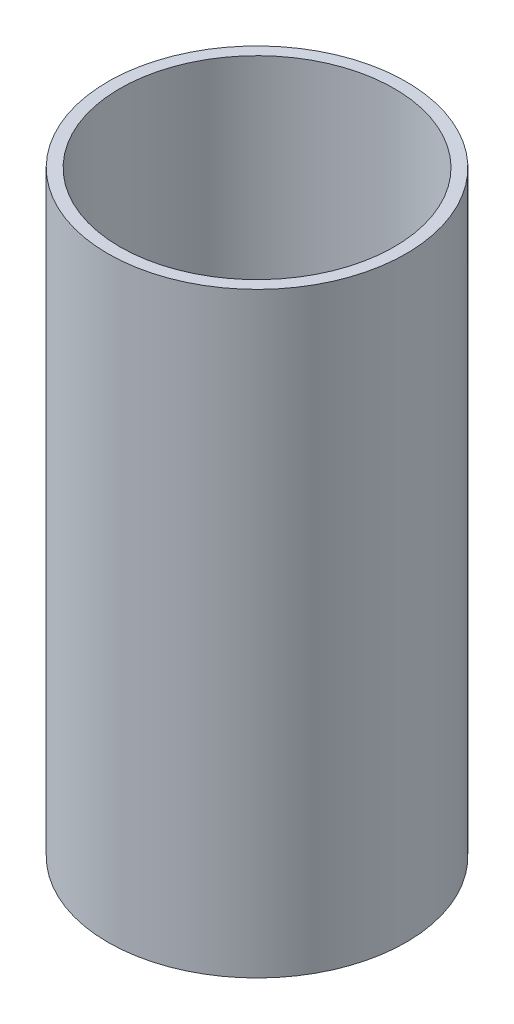
ISO-10303-21;
HEADER;
FILE_DESCRIPTION(('STEP AP214'),'2;1');
FILE_NAME('part.step','',(''),(''),'','','');
FILE_SCHEMA(('AUTOMOTIVE_DESIGN { 1 0 10303 214 1 1 1 1 }'));
ENDSEC;
DATA;
#1=APPLICATION_CONTEXT('core data for automotive mechanical design processes');
#2=APPLICATION_PROTOCOL_DEFINITION('international standard','automotive_design',2000,#1);
#3=PRODUCT_CONTEXT('',#1,'mechanical');
#4=PRODUCT('Part','Part','',(#3));
#5=PRODUCT_RELATED_PRODUCT_CATEGORY('part','',(#4));
#6=PRODUCT_DEFINITION_FORMATION('','',#4);
#7=PRODUCT_DEFINITION_CONTEXT('part definition',#1,'design');
#8=PRODUCT_DEFINITION('design','',#6,#7);
#9=PRODUCT_DEFINITION_SHAPE('','',#8);
#10=(LENGTH_UNIT() NAMED_UNIT(*) SI_UNIT(.MILLI.,.METRE.));
#11=(NAMED_UNIT(*) PLANE_ANGLE_UNIT() SI_UNIT($,.RADIAN.));
#12=(NAMED_UNIT(*) SI_UNIT($,.STERADIAN.) SOLID_ANGLE_UNIT());
#13=UNCERTAINTY_MEASURE_WITH_UNIT(LENGTH_MEASURE(1.E-05),#10,'distance_accuracy_value','');
#14=(GEOMETRIC_REPRESENTATION_CONTEXT(3) GLOBAL_UNCERTAINTY_ASSIGNED_CONTEXT((#13)) GLOBAL_UNIT_ASSIGNED_CONTEXT((#10,
#11,#12)) REPRESENTATION_CONTEXT('',''));
#15=CARTESIAN_POINT('',(0.,0.,0.));
#16=DIRECTION('',(0.,0.,1.));
#17=DIRECTION('',(1.,0.,0.));
#18=AXIS2_PLACEMENT_3D('',#15,#16,#17);
#19=CARTESIAN_POINT('',(0.,26.1689859870494,0.));
#20=DIRECTION('',(0.,1.,0.));
#21=DIRECTION('',(0.,0.,1.));
#22=AXIS2_PLACEMENT_3D('',#19,#20,#21);
#23=CYLINDRICAL_SURFACE('',#22,50.);
#24=CARTESIAN_POINT('',(0.,0.,0.));
#25=DIRECTION('',(0.,1.,0.));
#26=DIRECTION('',(0.,0.,1.));
#27=AXIS2_PLACEMENT_3D('',#24,#25,#26);
#28=CIRCLE('',#27,50.);
#29=CARTESIAN_POINT('',(0.,0.,50.));
#30=VERTEX_POINT('',#29);
#31=EDGE_CURVE('E47',#30,#30,#28,.T.);
#32=ORIENTED_EDGE('',*,*,#31,.T.);
#33=EDGE_LOOP('',(#32));
#34=FACE_BOUND('',#33,.T.);
#35=CARTESIAN_POINT('',(0.,200.,0.));
#36=DIRECTION('',(0.,1.,0.));
#37=DIRECTION('',(0.,0.,1.));
#38=AXIS2_PLACEMENT_3D('',#35,#36,#37);
#39=CIRCLE('',#38,50.);
#40=CARTESIAN_POINT('',(0.,200.,50.));
#41=VERTEX_POINT('',#40);
#42=EDGE_CURVE('E10',#41,#41,#39,.T.);
#43=ORIENTED_EDGE('',*,*,#42,.F.);
#44=EDGE_LOOP('',(#43));
#45=FACE_BOUND('',#44,.T.);
#46=ADVANCED_FACE('F33',(#34,#45),#23,.T.);
#47=CARTESIAN_POINT('',(-50.,200.,0.));
#48=DIRECTION('',(0.,-1.,0.));
#49=DIRECTION('',(0.,0.,-1.));
#50=AXIS2_PLACEMENT_3D('',#47,#48,#49);
#51=PLANE('',#50);
#52=CARTESIAN_POINT('',(0.,200.,0.));
#53=DIRECTION('',(0.,1.,0.));
#54=DIRECTION('',(0.,0.,1.));
#55=AXIS2_PLACEMENT_3D('',#52,#53,#54);
#56=CIRCLE('',#55,46.);
#57=CARTESIAN_POINT('',(0.,200.,46.));
#58=VERTEX_POINT('',#57);
#59=EDGE_CURVE('E39',#58,#58,#56,.T.);
#60=ORIENTED_EDGE('',*,*,#59,.F.);
#61=EDGE_LOOP('',(#60));
#62=FACE_BOUND('',#61,.T.);
#63=ORIENTED_EDGE('',*,*,#42,.T.);
#64=EDGE_LOOP('',(#63));
#65=FACE_BOUND('',#64,.T.);
#66=ADVANCED_FACE('F63',(#62,#65),#51,.F.);
#67=CARTESIAN_POINT('',(0.,26.1689859870494,0.));
#68=DIRECTION('',(0.,1.,0.));
#69=DIRECTION('',(0.,0.,1.));
#70=AXIS2_PLACEMENT_3D('',#67,#68,#69);
#71=CYLINDRICAL_SURFACE('',#70,46.);
#72=CARTESIAN_POINT('',(0.,0.,0.));
#73=DIRECTION('',(0.,1.,0.));
#74=DIRECTION('',(0.,0.,1.));
#75=AXIS2_PLACEMENT_3D('',#72,#73,#74);
#76=CIRCLE('',#75,46.);
#77=CARTESIAN_POINT('',(0.,0.,46.));
#78=VERTEX_POINT('',#77);
#79=EDGE_CURVE('E43',#78,#78,#76,.T.);
#80=ORIENTED_EDGE('',*,*,#79,.F.);
#81=EDGE_LOOP('',(#80));
#82=FACE_BOUND('',#81,.T.);
#83=ORIENTED_EDGE('',*,*,#59,.T.);
#84=EDGE_LOOP('',(#83));
#85=FACE_BOUND('',#84,.T.);
#86=ADVANCED_FACE('F58',(#82,#85),#71,.F.);
#87=CARTESIAN_POINT('',(-46.,0.,0.));
#88=DIRECTION('',(0.,1.,0.));
#89=DIRECTION('',(0.,0.,1.));
#90=AXIS2_PLACEMENT_3D('',#87,#88,#89);
#91=PLANE('',#90);
#92=ORIENTED_EDGE('',*,*,#31,.F.);
#93=EDGE_LOOP('',(#92));
#94=FACE_BOUND('',#93,.T.);
#95=ORIENTED_EDGE('',*,*,#79,.T.);
#96=EDGE_LOOP('',(#95));
#97=FACE_BOUND('',#96,.T.);
#98=ADVANCED_FACE('F55',(#94,#97),#91,.F.);
#99=CLOSED_SHELL('',(#46,#66,#86,#98));
#100=MANIFOLD_SOLID_BREP('B2',#99);
#101=ADVANCED_BREP_SHAPE_REPRESENTATION('',(#18,#100),#14);
#102=SHAPE_DEFINITION_REPRESENTATION(#9,#101);
ENDSEC;
END-ISO-10303-21;
